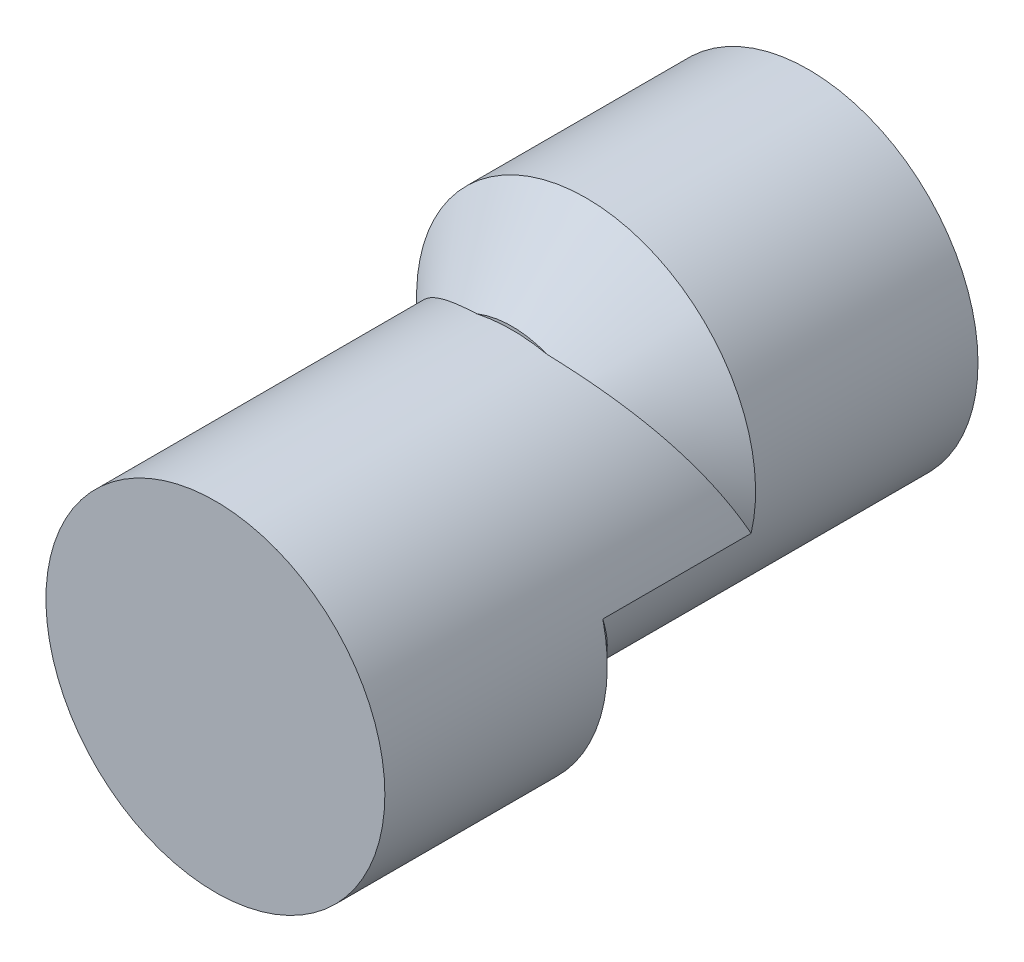
ISO-10303-21;
HEADER;
FILE_DESCRIPTION(('STEP AP214'),'2;1');
FILE_NAME('part.step','',(''),(''),'','','');
FILE_SCHEMA(('AUTOMOTIVE_DESIGN { 1 0 10303 214 1 1 1 1 }'));
ENDSEC;
DATA;
#1=APPLICATION_CONTEXT('core data for automotive mechanical design processes');
#2=APPLICATION_PROTOCOL_DEFINITION('international standard','automotive_design',2000,#1);
#3=PRODUCT_CONTEXT('',#1,'mechanical');
#4=PRODUCT('Part','Part','',(#3));
#5=PRODUCT_RELATED_PRODUCT_CATEGORY('part','',(#4));
#6=PRODUCT_DEFINITION_FORMATION('','',#4);
#7=PRODUCT_DEFINITION_CONTEXT('part definition',#1,'design');
#8=PRODUCT_DEFINITION('design','',#6,#7);
#9=PRODUCT_DEFINITION_SHAPE('','',#8);
#10=(LENGTH_UNIT() NAMED_UNIT(*) SI_UNIT(.MILLI.,.METRE.));
#11=(NAMED_UNIT(*) PLANE_ANGLE_UNIT() SI_UNIT($,.RADIAN.));
#12=(NAMED_UNIT(*) SI_UNIT($,.STERADIAN.) SOLID_ANGLE_UNIT());
#13=UNCERTAINTY_MEASURE_WITH_UNIT(LENGTH_MEASURE(1.E-05),#10,'distance_accuracy_value','');
#14=(GEOMETRIC_REPRESENTATION_CONTEXT(3) GLOBAL_UNCERTAINTY_ASSIGNED_CONTEXT((#13)) GLOBAL_UNIT_ASSIGNED_CONTEXT((#10,
#11,#12)) REPRESENTATION_CONTEXT('',''));
#15=CARTESIAN_POINT('',(0.,0.,0.));
#16=DIRECTION('',(0.,0.,1.));
#17=DIRECTION('',(1.,0.,0.));
#18=AXIS2_PLACEMENT_3D('',#15,#16,#17);
#19=CARTESIAN_POINT('',(0.,0.822072072072072,7.));
#20=DIRECTION('',(0.,0.,-1.));
#21=DIRECTION('',(-1.,0.,0.));
#22=AXIS2_PLACEMENT_3D('',#19,#20,#21);
#23=CYLINDRICAL_SURFACE('',#22,4.);
#24=CARTESIAN_POINT('',(0.,0.822072072072072,7.));
#25=DIRECTION('',(0.,0.,1.));
#26=DIRECTION('',(1.,0.,0.));
#27=AXIS2_PLACEMENT_3D('',#24,#25,#26);
#28=CIRCLE('',#27,4.);
#29=CARTESIAN_POINT('',(-0.832416826561857,-3.09035456965,7.));
#30=VERTEX_POINT('',#29);
#31=CARTESIAN_POINT('',(0.832416826561857,-3.09035456965,7.));
#32=VERTEX_POINT('',#31);
#33=EDGE_CURVE('E126',#30,#32,#28,.T.);
#34=ORIENTED_EDGE('',*,*,#33,.F.);
#35=CARTESIAN_POINT('',(-0.832416826561859,-3.09035456965,7.));
#36=CARTESIAN_POINT('',(-0.928283112962649,-3.06996119736182,7.01651059702666));
#37=CARTESIAN_POINT('',(-1.02289258695509,-3.04614512237589,7.03561942137898));
#38=CARTESIAN_POINT('',(-1.20909359386115,-2.9920435632729,7.07835176839966));
#39=CARTESIAN_POINT('',(-1.30068814168173,-2.96176478361378,7.10197060968749));
#40=CARTESIAN_POINT('',(-1.56947440841262,-2.86209877848865,7.17834381647651));
#41=CARTESIAN_POINT('',(-1.74175685502727,-2.78364402787083,7.23681585373251));
#42=CARTESIAN_POINT('',(-2.0779143594082,-2.60144986224845,7.36697500086163));
#43=CARTESIAN_POINT('',(-2.24106500081024,-2.49673363584971,7.43913745432706));
#44=CARTESIAN_POINT('',(-2.54883249725891,-2.26668666188954,7.59074588528036));
#45=CARTESIAN_POINT('',(-2.69341002483402,-2.14131341424269,7.67020672622366));
#46=CARTESIAN_POINT('',(-2.98907543887914,-1.84577692198815,7.84959275576821));
#47=CARTESIAN_POINT('',(-3.1356802439645,-1.67167082236258,7.95043192755659));
#48=CARTESIAN_POINT('',(-3.39684252708479,-1.30220910340953,8.15428576356132));
#49=CARTESIAN_POINT('',(-3.51142019835684,-1.10686698189474,8.25729901274184));
#50=CARTESIAN_POINT('',(-3.67088036612868,-0.773360208952291,8.42563317432922));
#51=CARTESIAN_POINT('',(-3.72598282228731,-0.640063734032256,8.49111344983434));
#52=CARTESIAN_POINT('',(-3.82151563065921,-0.368199923437119,8.62126290483657));
#53=CARTESIAN_POINT('',(-3.86196748324567,-0.229640644049144,8.68593313734113));
#54=CARTESIAN_POINT('',(-3.89487013147342,-0.088963963963964,8.75));
#55=B_SPLINE_CURVE_WITH_KNOTS('',3,(#35,#36,#37,#38,#39,#40,#41,#42,#43,#44,#45,#46,#47,#48,#49,
#50,#51,#52,#53,#54),.UNSPECIFIED.,.F.,.F.,(4,2,2,2,2,2,2,2,2,4),(0.,0.297945292975673,
0.595582984689978,1.18750437414797,1.805993153621,2.42577068629197,3.16952850456355,
3.91281631729058,4.38731643902962,4.86111736304012),.UNSPECIFIED.);
#56=CARTESIAN_POINT('',(-3.89487013147342,-0.0889639639639639,8.75));
#57=VERTEX_POINT('',#56);
#58=EDGE_CURVE('E11',#30,#57,#55,.T.);
#59=ORIENTED_EDGE('',*,*,#58,.T.);
#60=DIRECTION('',(0.,0.,-1.));
#61=VECTOR('',#60,1.);
#62=CARTESIAN_POINT('',(-3.89487013147342,-0.0889639639639639,7.));
#63=LINE('',#62,#61);
#64=CARTESIAN_POINT('',(-3.89487013147342,-0.0889639639639639,5.25));
#65=VERTEX_POINT('',#64);
#66=EDGE_CURVE('E138',#57,#65,#63,.T.);
#67=ORIENTED_EDGE('',*,*,#66,.T.);
#68=CARTESIAN_POINT('',(0.,0.822072072072072,5.25));
#69=DIRECTION('',(0.,0.,1.));
#70=DIRECTION('',(1.,0.,0.));
#71=AXIS2_PLACEMENT_3D('',#68,#69,#70);
#72=CIRCLE('',#71,4.);
#73=CARTESIAN_POINT('',(3.89487013147342,-0.0889639639639639,5.25));
#74=VERTEX_POINT('',#73);
#75=EDGE_CURVE('E135',#65,#74,#72,.F.);
#76=ORIENTED_EDGE('',*,*,#75,.T.);
#77=DIRECTION('',(0.,0.,-1.));
#78=VECTOR('',#77,1.);
#79=CARTESIAN_POINT('',(3.89487013147342,-0.0889639639639639,5.25));
#80=LINE('',#79,#78);
#81=CARTESIAN_POINT('',(3.89487013147342,-0.0889639639639639,8.75));
#82=VERTEX_POINT('',#81);
#83=EDGE_CURVE('E133',#74,#82,#80,.F.);
#84=ORIENTED_EDGE('',*,*,#83,.T.);
#85=CARTESIAN_POINT('',(3.89487013147342,-0.0889639639639639,8.75));
#86=CARTESIAN_POINT('',(3.86671510700556,-0.20930511358178,8.695185950325));
#87=CARTESIAN_POINT('',(3.83305308898068,-0.328083131837898,8.63994832234659));
#88=CARTESIAN_POINT('',(3.75501638353348,-0.561781737687089,8.52889763527694));
#89=CARTESIAN_POINT('',(3.71064221893601,-0.676702513227862,8.47308460439647));
#90=CARTESIAN_POINT('',(3.56183423666266,-1.01474572989651,8.30510932270334));
#91=CARTESIAN_POINT('',(3.44175218227322,-1.23099123667768,8.1924826090431));
#92=CARTESIAN_POINT('',(3.1632482341429,-1.63861802406267,7.96951787937824));
#93=CARTESIAN_POINT('',(3.004794062874,-1.82997816241363,7.85918187553825));
#94=CARTESIAN_POINT('',(2.65264711808882,-2.18214495843101,7.64542303566663));
#95=CARTESIAN_POINT('',(2.45896550477505,-2.3429612596235,7.54199802435239));
#96=CARTESIAN_POINT('',(2.16639693700184,-2.5419908605226,7.40750387581899));
#97=CARTESIAN_POINT('',(2.08055864745726,-2.59576964782898,7.37032952379564));
#98=CARTESIAN_POINT('',(1.90409366313856,-2.69712779375485,7.29887037535157));
#99=CARTESIAN_POINT('',(1.81346667388939,-2.74470677049976,7.26458575696859));
#100=CARTESIAN_POINT('',(1.62805792650162,-2.83305385457416,7.19973318709954));
#101=CARTESIAN_POINT('',(1.53329002911455,-2.87384277029053,7.16915396172359));
#102=CARTESIAN_POINT('',(1.33976628553074,-2.94830717495983,7.11240256046847));
#103=CARTESIAN_POINT('',(1.24101319575274,-2.98198748354147,7.08622740109473));
#104=CARTESIAN_POINT('',(1.09000403222972,-3.02691140921662,7.05083397924406));
#105=CARTESIAN_POINT('',(1.03903129482042,-3.04098683989311,7.03965354272527));
#106=CARTESIAN_POINT('',(0.936297584227293,-3.06716389036262,7.01872627941883));
#107=CARTESIAN_POINT('',(0.884536696254955,-3.0792657218992,7.00897929884956));
#108=CARTESIAN_POINT('',(0.832416826561863,-3.09035456965,6.99999999999998));
#109=B_SPLINE_CURVE_WITH_KNOTS('',3,(#85,#86,#87,#88,#89,#90,#91,#92,#93,#94,#95,#96,#97,#98,
#99,#100,#101,#102,#103,#104,#105,#106,#107,#108),.UNSPECIFIED.,.F.,.F.,(4,2,2,2,2,2,2,2,2,2,2,
4),(0.,0.405339054933944,0.81065833059254,1.6218221294166,2.43367064072074,3.24526240155843,
3.56872160205691,3.89220071647291,4.21466950204085,4.53691894673024,4.69901383965477,
4.86109133028042),.UNSPECIFIED.);
#110=EDGE_CURVE('E50',#82,#32,#109,.T.);
#111=ORIENTED_EDGE('',*,*,#110,.T.);
#112=EDGE_LOOP('',(#34,#59,#67,#76,#84,#111));
#113=FACE_BOUND('',#112,.T.);
#114=CARTESIAN_POINT('',(0.,0.822072072072072,0.));
#115=DIRECTION('',(0.,0.,1.));
#116=DIRECTION('',(1.,0.,0.));
#117=AXIS2_PLACEMENT_3D('',#114,#115,#116);
#118=CIRCLE('',#117,4.);
#119=CARTESIAN_POINT('',(4.,0.822072072072072,0.));
#120=VERTEX_POINT('',#119);
#121=EDGE_CURVE('E123',#120,#120,#118,.T.);
#122=ORIENTED_EDGE('',*,*,#121,.T.);
#123=EDGE_LOOP('',(#122));
#124=FACE_BOUND('',#123,.T.);
#125=ADVANCED_FACE('F35',(#113,#124),#23,.T.);
#126=CARTESIAN_POINT('',(0.,0.822072072072072,7.));
#127=DIRECTION('',(0.,0.,1.));
#128=DIRECTION('',(1.,0.,0.));
#129=AXIS2_PLACEMENT_3D('',#126,#127,#128);
#130=PLANE('',#129);
#131=CARTESIAN_POINT('',(0.,-1.,7.));
#132=DIRECTION('',(0.,0.,1.));
#133=DIRECTION('',(1.,0.,0.));
#134=AXIS2_PLACEMENT_3D('',#131,#132,#133);
#135=CIRCLE('',#134,4.);
#136=CARTESIAN_POINT('',(0.83241682656191,2.91242664172207,7.));
#137=VERTEX_POINT('',#136);
#138=CARTESIAN_POINT('',(-0.83241682656191,2.91242664172207,7.));
#139=VERTEX_POINT('',#138);
#140=EDGE_CURVE('E118',#137,#139,#135,.T.);
#141=ORIENTED_EDGE('',*,*,#140,.F.);
#142=CARTESIAN_POINT('',(0.,0.822072072072072,7.));
#143=DIRECTION('',(0.,0.,1.));
#144=DIRECTION('',(1.,0.,0.));
#145=AXIS2_PLACEMENT_3D('',#142,#143,#144);
#146=CIRCLE('',#145,2.25);
#147=EDGE_CURVE('E128',#137,#139,#146,.T.);
#148=ORIENTED_EDGE('',*,*,#147,.T.);
#149=EDGE_LOOP('',(#141,#148));
#150=FACE_BOUND('',#149,.T.);
#151=ADVANCED_FACE('F170',(#150),#130,.T.);
#152=CARTESIAN_POINT('',(0.,0.822072072072072,0.));
#153=DIRECTION('',(0.,0.,1.));
#154=DIRECTION('',(1.,0.,0.));
#155=AXIS2_PLACEMENT_3D('',#152,#153,#154);
#156=PLANE('',#155);
#157=DIRECTION('',(-1.,0.,0.));
#158=VECTOR('',#157,1.);
#159=CARTESIAN_POINT('',(-1.51657508881031,2.05,0.));
#160=LINE('',#159,#158);
#161=CARTESIAN_POINT('',(1.51657508881031,2.05,0.));
#162=VERTEX_POINT('',#161);
#163=CARTESIAN_POINT('',(-1.51657508881031,2.05,0.));
#164=VERTEX_POINT('',#163);
#165=EDGE_CURVE('E105',#162,#164,#160,.T.);
#166=ORIENTED_EDGE('',*,*,#165,.T.);
#167=CARTESIAN_POINT('',(0.,0.,0.));
#168=DIRECTION('',(0.,0.,1.));
#169=DIRECTION('',(1.,0.,0.));
#170=AXIS2_PLACEMENT_3D('',#167,#168,#169);
#171=CIRCLE('',#170,2.55);
#172=EDGE_CURVE('E97',#164,#162,#171,.T.);
#173=ORIENTED_EDGE('',*,*,#172,.T.);
#174=EDGE_LOOP('',(#166,#173));
#175=FACE_BOUND('',#174,.T.);
#176=ORIENTED_EDGE('',*,*,#121,.F.);
#177=EDGE_LOOP('',(#176));
#178=FACE_BOUND('',#177,.T.);
#179=ADVANCED_FACE('F111',(#175,#178),#156,.F.);
#180=CARTESIAN_POINT('',(0.,-1.,7.));
#181=DIRECTION('',(0.,0.,1.));
#182=DIRECTION('',(1.,0.,0.));
#183=AXIS2_PLACEMENT_3D('',#180,#181,#182);
#184=PLANE('',#183);
#185=ORIENTED_EDGE('',*,*,#33,.T.);
#186=CARTESIAN_POINT('',(0.,-1.,7.));
#187=DIRECTION('',(0.,0.,1.));
#188=DIRECTION('',(1.,0.,0.));
#189=AXIS2_PLACEMENT_3D('',#186,#187,#188);
#190=CIRCLE('',#189,2.24999999999999);
#191=EDGE_CURVE('E62',#32,#30,#190,.F.);
#192=ORIENTED_EDGE('',*,*,#191,.T.);
#193=EDGE_LOOP('',(#185,#192));
#194=FACE_BOUND('',#193,.T.);
#195=ADVANCED_FACE('F232',(#194),#184,.F.);
#196=CARTESIAN_POINT('',(0.,-1.,14.));
#197=DIRECTION('',(0.,0.,-1.));
#198=DIRECTION('',(-1.,0.,0.));
#199=AXIS2_PLACEMENT_3D('',#196,#197,#198);
#200=CYLINDRICAL_SURFACE('',#199,4.);
#201=CARTESIAN_POINT('',(0.,-1.,14.));
#202=DIRECTION('',(0.,0.,1.));
#203=DIRECTION('',(1.,0.,0.));
#204=AXIS2_PLACEMENT_3D('',#201,#202,#203);
#205=CIRCLE('',#204,4.);
#206=CARTESIAN_POINT('',(4.,-1.,14.));
#207=VERTEX_POINT('',#206);
#208=EDGE_CURVE('E120',#207,#207,#205,.T.);
#209=ORIENTED_EDGE('',*,*,#208,.F.);
#210=EDGE_LOOP('',(#209));
#211=FACE_BOUND('',#210,.T.);
#212=CARTESIAN_POINT('',(0.,-1.,8.75));
#213=DIRECTION('',(0.,0.,1.));
#214=DIRECTION('',(1.,0.,0.));
#215=AXIS2_PLACEMENT_3D('',#212,#213,#214);
#216=CIRCLE('',#215,4.);
#217=EDGE_CURVE('E177',#57,#82,#216,.T.);
#218=ORIENTED_EDGE('',*,*,#217,.T.);
#219=ORIENTED_EDGE('',*,*,#83,.F.);
#220=CARTESIAN_POINT('',(3.89487013147342,-0.0889639639639639,5.25));
#221=CARTESIAN_POINT('',(3.86671510700556,0.0313771856538526,5.30481404967499));
#222=CARTESIAN_POINT('',(3.83305308898068,0.15015520390997,5.36005167765341));
#223=CARTESIAN_POINT('',(3.75501638353348,0.383853809759161,5.47110236472306));
#224=CARTESIAN_POINT('',(3.71064221893601,0.498774585299935,5.52691539560353));
#225=CARTESIAN_POINT('',(3.56183423666265,0.836817801968578,5.69489067729666));
#226=CARTESIAN_POINT('',(3.44175218227322,1.05306330874975,5.8075173909569));
#227=CARTESIAN_POINT('',(3.1632482341429,1.46069009613475,6.03048212062176));
#228=CARTESIAN_POINT('',(3.00479406287399,1.65205023448571,6.14081812446175));
#229=CARTESIAN_POINT('',(2.65264711808882,2.00421703050309,6.35457696433337));
#230=CARTESIAN_POINT('',(2.45896550477505,2.16503333169557,6.45800197564762));
#231=CARTESIAN_POINT('',(2.16639693700183,2.36406293259467,6.59249612418102));
#232=CARTESIAN_POINT('',(2.08055864745725,2.41784171990105,6.62967047620436));
#233=CARTESIAN_POINT('',(1.90409366313856,2.51919986582692,6.70112962464844));
#234=CARTESIAN_POINT('',(1.81346667388938,2.56677884257183,6.73541424303142));
#235=CARTESIAN_POINT('',(1.62805792650162,2.65512592664623,6.80026681290047));
#236=CARTESIAN_POINT('',(1.53329002911455,2.6959148423626,6.83084603827642));
#237=CARTESIAN_POINT('',(1.33976628553074,2.77037924703191,6.88759743953154));
#238=CARTESIAN_POINT('',(1.24101319575273,2.80405955561355,6.91377259890528));
#239=CARTESIAN_POINT('',(1.09000403222972,2.84898348128869,6.94916602075595));
#240=CARTESIAN_POINT('',(1.03903129482043,2.86305891196518,6.96034645727474));
#241=CARTESIAN_POINT('',(0.936297584227324,2.88923596243468,6.98127372058117));
#242=CARTESIAN_POINT('',(0.884536696254996,2.90133779397126,6.99102070115045));
#243=CARTESIAN_POINT('',(0.832416826561914,2.91242664172207,7.00000000000002));
#244=B_SPLINE_CURVE_WITH_KNOTS('',3,(#220,#221,#222,#223,#224,#225,#226,#227,#228,#229,#230,
#231,#232,#233,#234,#235,#236,#237,#238,#239,#240,#241,#242,#243),.UNSPECIFIED.,.F.,.F.,(4,2,2,
2,2,2,2,2,2,2,2,4),(0.,0.405339054933944,0.810658330592541,1.62182212941661,2.43367064072074,
3.24526240155844,3.56872160205692,3.89220071647292,4.21466950204086,4.53691894673026,
4.69901383965475,4.86109133028037),.UNSPECIFIED.);
#245=EDGE_CURVE('E148',#74,#137,#244,.T.);
#246=ORIENTED_EDGE('',*,*,#245,.T.);
#247=ORIENTED_EDGE('',*,*,#140,.T.);
#248=CARTESIAN_POINT('',(-0.83241682656191,2.91242664172207,7.));
#249=CARTESIAN_POINT('',(-0.9282831129627,2.89203326943388,6.98348940297334));
#250=CARTESIAN_POINT('',(-1.02289258695514,2.86821719444795,6.96438057862102));
#251=CARTESIAN_POINT('',(-1.2090935938612,2.81411563534495,6.92164823160034));
#252=CARTESIAN_POINT('',(-1.30068814168178,2.78383685568583,6.8980293903125));
#253=CARTESIAN_POINT('',(-1.56947440841267,2.68417085056069,6.82165618352348));
#254=CARTESIAN_POINT('',(-1.74175685502733,2.60571609994288,6.76318414626748));
#255=CARTESIAN_POINT('',(-2.07791435940826,2.42352193432049,6.63302499913835));
#256=CARTESIAN_POINT('',(-2.24106500081029,2.31880570792175,6.56086254567292));
#257=CARTESIAN_POINT('',(-2.54883249725896,2.08875873396157,6.40925411471962));
#258=CARTESIAN_POINT('',(-2.69341002483407,1.96338548631471,6.32979327377632));
#259=CARTESIAN_POINT('',(-2.98907543887919,1.66784899406017,6.15040724423176));
#260=CARTESIAN_POINT('',(-3.13568024396454,1.4937428944346,6.04956807244338));
#261=CARTESIAN_POINT('',(-3.39684252708483,1.12428117548154,5.84571423643864));
#262=CARTESIAN_POINT('',(-3.51142019835687,0.928939053966743,5.74270098725813));
#263=CARTESIAN_POINT('',(-3.6708803661287,0.595432281024306,5.57436682567075));
#264=CARTESIAN_POINT('',(-3.72598282228733,0.462135806104281,5.50888655016564));
#265=CARTESIAN_POINT('',(-3.82151563065922,0.190271995509168,5.37873709516342));
#266=CARTESIAN_POINT('',(-3.86196748324567,0.0517127161212047,5.31406686265886));
#267=CARTESIAN_POINT('',(-3.89487013147342,-0.0889639639639637,5.25));
#268=B_SPLINE_CURVE_WITH_KNOTS('',3,(#248,#249,#250,#251,#252,#253,#254,#255,#256,#257,#258,
#259,#260,#261,#262,#263,#264,#265,#266,#267),.UNSPECIFIED.,.F.,.F.,(4,2,2,2,2,2,2,2,2,4),(0.,
0.297945292975674,0.595582984689982,1.18750437414798,1.80599315362102,2.42577068629199,
3.16952850456358,3.91281631729061,4.38731643902961,4.86111736304007),.UNSPECIFIED.);
#269=EDGE_CURVE('E141',#139,#65,#268,.T.);
#270=ORIENTED_EDGE('',*,*,#269,.T.);
#271=ORIENTED_EDGE('',*,*,#66,.F.);
#272=EDGE_LOOP('',(#218,#219,#246,#247,#270,#271));
#273=FACE_BOUND('',#272,.T.);
#274=ADVANCED_FACE('F154',(#211,#273),#200,.T.);
#275=CARTESIAN_POINT('',(0.,-1.,14.));
#276=DIRECTION('',(0.,0.,1.));
#277=DIRECTION('',(1.,0.,0.));
#278=AXIS2_PLACEMENT_3D('',#275,#276,#277);
#279=PLANE('',#278);
#280=ORIENTED_EDGE('',*,*,#208,.T.);
#281=EDGE_LOOP('',(#280));
#282=FACE_BOUND('',#281,.T.);
#283=ADVANCED_FACE('F218',(#282),#279,.T.);
#284=CARTESIAN_POINT('',(0.,0.,0.));
#285=DIRECTION('',(0.,0.,1.));
#286=DIRECTION('',(1.,0.,0.));
#287=AXIS2_PLACEMENT_3D('',#284,#285,#286);
#288=CYLINDRICAL_SURFACE('',#287,2.55);
#289=CARTESIAN_POINT('',(0.,0.,12.));
#290=DIRECTION('',(0.,0.,1.));
#291=DIRECTION('',(1.,0.,0.));
#292=AXIS2_PLACEMENT_3D('',#289,#290,#291);
#293=CIRCLE('',#292,2.55);
#294=CARTESIAN_POINT('',(-1.51657508881031,2.05,12.));
#295=VERTEX_POINT('',#294);
#296=CARTESIAN_POINT('',(1.51657508881031,2.05,12.));
#297=VERTEX_POINT('',#296);
#298=EDGE_CURVE('E100',#295,#297,#293,.T.);
#299=ORIENTED_EDGE('',*,*,#298,.T.);
#300=DIRECTION('',(0.,0.,1.));
#301=VECTOR('',#300,1.);
#302=CARTESIAN_POINT('',(1.51657508881031,2.05,0.));
#303=LINE('',#302,#301);
#304=EDGE_CURVE('E93',#162,#297,#303,.T.);
#305=ORIENTED_EDGE('',*,*,#304,.F.);
#306=ORIENTED_EDGE('',*,*,#172,.F.);
#307=DIRECTION('',(0.,0.,1.));
#308=VECTOR('',#307,1.);
#309=CARTESIAN_POINT('',(-1.51657508881031,2.05,0.));
#310=LINE('',#309,#308);
#311=EDGE_CURVE('E104',#164,#295,#310,.T.);
#312=ORIENTED_EDGE('',*,*,#311,.T.);
#313=EDGE_LOOP('',(#299,#305,#306,#312));
#314=FACE_BOUND('',#313,.T.);
#315=ADVANCED_FACE('F95',(#314),#288,.F.);
#316=CARTESIAN_POINT('',(-1.51657508881031,2.05,0.));
#317=DIRECTION('',(0.,1.,0.));
#318=DIRECTION('',(0.,0.,1.));
#319=AXIS2_PLACEMENT_3D('',#316,#317,#318);
#320=PLANE('',#319);
#321=DIRECTION('',(-1.,0.,0.));
#322=VECTOR('',#321,1.);
#323=CARTESIAN_POINT('',(-1.51657508881031,2.05,12.));
#324=LINE('',#323,#322);
#325=EDGE_CURVE('E113',#297,#295,#324,.T.);
#326=ORIENTED_EDGE('',*,*,#325,.T.);
#327=ORIENTED_EDGE('',*,*,#311,.F.);
#328=ORIENTED_EDGE('',*,*,#165,.F.);
#329=ORIENTED_EDGE('',*,*,#304,.T.);
#330=EDGE_LOOP('',(#326,#327,#328,#329));
#331=FACE_BOUND('',#330,.T.);
#332=ADVANCED_FACE('F108',(#331),#320,.F.);
#333=CARTESIAN_POINT('',(0.,0.,12.));
#334=DIRECTION('',(0.,0.,1.));
#335=DIRECTION('',(1.,0.,0.));
#336=AXIS2_PLACEMENT_3D('',#333,#334,#335);
#337=PLANE('',#336);
#338=ORIENTED_EDGE('',*,*,#298,.F.);
#339=ORIENTED_EDGE('',*,*,#325,.F.);
#340=EDGE_LOOP('',(#338,#339));
#341=FACE_BOUND('',#340,.T.);
#342=ADVANCED_FACE('F164',(#341),#337,.F.);
#343=CARTESIAN_POINT('',(0.,0.822072072072072,7.));
#344=DIRECTION('',(0.,0.,-1.));
#345=DIRECTION('',(-1.,0.,0.));
#346=AXIS2_PLACEMENT_3D('',#343,#344,#345);
#347=CONICAL_SURFACE('',#346,2.25,0.785398163397446);
#348=ORIENTED_EDGE('',*,*,#245,.F.);
#349=ORIENTED_EDGE('',*,*,#75,.F.);
#350=ORIENTED_EDGE('',*,*,#269,.F.);
#351=ORIENTED_EDGE('',*,*,#147,.F.);
#352=EDGE_LOOP('',(#348,#349,#350,#351));
#353=FACE_BOUND('',#352,.T.);
#354=ADVANCED_FACE('F159',(#353),#347,.T.);
#355=CARTESIAN_POINT('',(0.,-1.,8.75));
#356=DIRECTION('',(0.,0.,1.));
#357=DIRECTION('',(1.,0.,0.));
#358=AXIS2_PLACEMENT_3D('',#355,#356,#357);
#359=CONICAL_SURFACE('',#358,4.,0.78539816339745);
#360=ORIENTED_EDGE('',*,*,#58,.F.);
#361=ORIENTED_EDGE('',*,*,#191,.F.);
#362=ORIENTED_EDGE('',*,*,#110,.F.);
#363=ORIENTED_EDGE('',*,*,#217,.F.);
#364=EDGE_LOOP('',(#360,#361,#362,#363));
#365=FACE_BOUND('',#364,.T.);
#366=ADVANCED_FACE('F38',(#365),#359,.T.);
#367=CLOSED_SHELL('',(#125,#151,#179,#195,#274,#283,#315,#332,#342,#354,#366));
#368=MANIFOLD_SOLID_BREP('B2',#367);
#369=ADVANCED_BREP_SHAPE_REPRESENTATION('',(#18,#368),#14);
#370=SHAPE_DEFINITION_REPRESENTATION(#9,#369);
ENDSEC;
END-ISO-10303-21;
